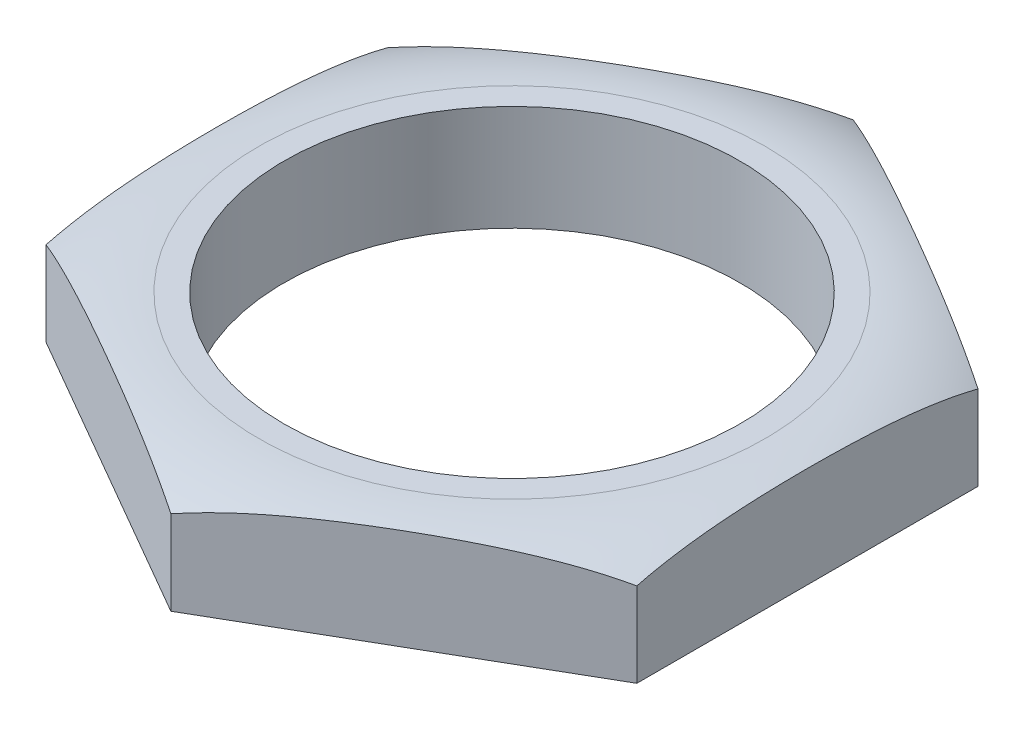
ISO-10303-21;
HEADER;
FILE_DESCRIPTION(('STEP AP214'),'2;1');
FILE_NAME('part.step','',(''),(''),'','','');
FILE_SCHEMA(('AUTOMOTIVE_DESIGN { 1 0 10303 214 1 1 1 1 }'));
ENDSEC;
DATA;
#1=APPLICATION_CONTEXT('core data for automotive mechanical design processes');
#2=APPLICATION_PROTOCOL_DEFINITION('international standard','automotive_design',2000,#1);
#3=PRODUCT_CONTEXT('',#1,'mechanical');
#4=PRODUCT('Part','Part','',(#3));
#5=PRODUCT_RELATED_PRODUCT_CATEGORY('part','',(#4));
#6=PRODUCT_DEFINITION_FORMATION('','',#4);
#7=PRODUCT_DEFINITION_CONTEXT('part definition',#1,'design');
#8=PRODUCT_DEFINITION('design','',#6,#7);
#9=PRODUCT_DEFINITION_SHAPE('','',#8);
#10=(LENGTH_UNIT() NAMED_UNIT(*) SI_UNIT(.MILLI.,.METRE.));
#11=(NAMED_UNIT(*) PLANE_ANGLE_UNIT() SI_UNIT($,.RADIAN.));
#12=(NAMED_UNIT(*) SI_UNIT($,.STERADIAN.) SOLID_ANGLE_UNIT());
#13=UNCERTAINTY_MEASURE_WITH_UNIT(LENGTH_MEASURE(1.E-05),#10,'distance_accuracy_value','');
#14=(GEOMETRIC_REPRESENTATION_CONTEXT(3) GLOBAL_UNCERTAINTY_ASSIGNED_CONTEXT((#13)) GLOBAL_UNIT_ASSIGNED_CONTEXT((#10,
#11,#12)) REPRESENTATION_CONTEXT('',''));
#15=CARTESIAN_POINT('',(0.,0.,0.));
#16=DIRECTION('',(0.,0.,1.));
#17=DIRECTION('',(1.,0.,0.));
#18=AXIS2_PLACEMENT_3D('',#15,#16,#17);
#19=CARTESIAN_POINT('',(-7.00000000000001,2.5,4.04145188432739));
#20=DIRECTION('',(0.5,0.,-0.866025403784439));
#21=DIRECTION('',(-0.866025403784439,0.,-0.5));
#22=AXIS2_PLACEMENT_3D('',#19,#20,#21);
#23=PLANE('',#22);
#24=CARTESIAN_POINT('',(-7.00020000000001,1.99994116980286,4.04133641427355));
#25=CARTESIAN_POINT('',(-6.9024311014993,2.0286993831664,4.09778331414131));
#26=CARTESIAN_POINT('',(-6.80418969926138,2.05522529599226,4.15450301416894));
#27=CARTESIAN_POINT('',(-6.60698058300385,2.10421745915421,4.26836175052687));
#28=CARTESIAN_POINT('',(-6.50801310707109,2.12668498334686,4.32550064939766));
#29=CARTESIAN_POINT('',(-6.21057702723731,2.18856517104633,4.49722545015641));
#30=CARTESIAN_POINT('',(-6.01125809296299,2.22254555707963,4.61230229051428));
#31=CARTESIAN_POINT('',(-5.61187383638535,2.27902121376591,4.84288689855947));
#32=CARTESIAN_POINT('',(-5.41181083347395,2.30153953390099,4.95839332714525));
#33=CARTESIAN_POINT('',(-5.01102203202369,2.33787021052581,5.18978884955075));
#34=CARTESIAN_POINT('',(-4.8102959726561,2.35167858888466,5.30567809396));
#35=CARTESIAN_POINT('',(-4.41139166909279,2.37247711056305,5.53598560100318));
#36=CARTESIAN_POINT('',(-4.21321681473248,2.37955940648222,5.65040190651472));
#37=CARTESIAN_POINT('',(-3.81680674878295,2.38844213687994,5.87926936480015));
#38=CARTESIAN_POINT('',(-3.61857154727333,2.39024320424813,5.9937205117546));
#39=CARTESIAN_POINT('',(-3.22195088730458,2.38889842275438,6.22270955655372));
#40=CARTESIAN_POINT('',(-3.02356543868272,2.38574852316797,6.33724744871886));
#41=CARTESIAN_POINT('',(-2.62692129753596,2.37391853623602,6.56625005038243));
#42=CARTESIAN_POINT('',(-2.42866259892704,2.3652387379873,6.68071476339347));
#43=CARTESIAN_POINT('',(-2.04346106415746,2.34159425160727,6.90311097318494));
#44=CARTESIAN_POINT('',(-1.85650172632777,2.32700568113752,7.01105199720843));
#45=CARTESIAN_POINT('',(-1.483336176554,2.28984184299611,7.22649922782261));
#46=CARTESIAN_POINT('',(-1.2971294295794,2.267273943215,7.33400574331332));
#47=CARTESIAN_POINT('',(-0.924632405346208,2.21176709168973,7.54906700052669));
#48=CARTESIAN_POINT('',(-0.738348978778219,2.17876375876016,7.65661778700128));
#49=CARTESIAN_POINT('',(-0.367459215426489,2.09976581999723,7.87075109171208));
#50=CARTESIAN_POINT('',(-0.182857484902704,2.05374271569793,7.97733095052286));
#51=CARTESIAN_POINT('',(0.000199999999992005,1.99994116980285,8.08301923870861));
#52=B_SPLINE_CURVE_WITH_KNOTS('',3,(#24,#25,#26,#27,#28,#29,#30,#31,#32,#33,#34,#35,#36,#37,#38,
#39,#40,#41,#42,#43,#44,#45,#46,#47,#48,#49,#50,#51),.UNSPECIFIED.,.F.,.F.,(4,2,2,2,2,2,2,2,2,2,
2,2,2,4),(0.,0.349439881640927,0.698769888950332,1.39630239063579,2.09242660183265,
2.78886852719074,3.47562481718198,4.16229880460008,4.84953489945155,5.53673506932823,
6.18574156363536,6.83415034176719,7.48664019182583,8.14056945107881),.UNSPECIFIED.);
#53=CARTESIAN_POINT('',(-7.00000000000001,2.00000000000001,4.04145188432739));
#54=VERTEX_POINT('',#53);
#55=CARTESIAN_POINT('',(0.,2.,8.08290376865477));
#56=VERTEX_POINT('',#55);
#57=EDGE_CURVE('E140',#54,#56,#52,.T.);
#58=ORIENTED_EDGE('',*,*,#57,.F.);
#59=DIRECTION('',(0.,-1.,0.));
#60=VECTOR('',#59,1.);
#61=CARTESIAN_POINT('',(-7.00000000000001,2.5,4.04145188432739));
#62=LINE('',#61,#60);
#63=CARTESIAN_POINT('',(-7.00000000000001,0.,4.04145188432739));
#64=VERTEX_POINT('',#63);
#65=EDGE_CURVE('E57',#54,#64,#62,.T.);
#66=ORIENTED_EDGE('',*,*,#65,.T.);
#67=DIRECTION('',(0.866025403784439,0.,0.5));
#68=VECTOR('',#67,1.);
#69=CARTESIAN_POINT('',(-7.00000000000001,0.,4.04145188432739));
#70=LINE('',#69,#68);
#71=CARTESIAN_POINT('',(0.,0.,8.08290376865477));
#72=VERTEX_POINT('',#71);
#73=EDGE_CURVE('E127',#64,#72,#70,.T.);
#74=ORIENTED_EDGE('',*,*,#73,.T.);
#75=DIRECTION('',(0.,-1.,0.));
#76=VECTOR('',#75,1.);
#77=CARTESIAN_POINT('',(0.,2.5,8.08290376865477));
#78=LINE('',#77,#76);
#79=EDGE_CURVE('E11',#56,#72,#78,.T.);
#80=ORIENTED_EDGE('',*,*,#79,.F.);
#81=EDGE_LOOP('',(#58,#66,#74,#80));
#82=FACE_BOUND('',#81,.T.);
#83=ADVANCED_FACE('F34',(#82),#23,.F.);
#84=CARTESIAN_POINT('',(0.,2.5,8.08290376865477));
#85=DIRECTION('',(-0.5,0.,-0.866025403784439));
#86=DIRECTION('',(-0.866025403784439,0.,0.5));
#87=AXIS2_PLACEMENT_3D('',#84,#85,#86);
#88=PLANE('',#87);
#89=CARTESIAN_POINT('',(-0.000199999999999705,1.99994116980285,8.08301923870861));
#90=CARTESIAN_POINT('',(0.0975688985007056,2.02869938316639,8.02657233884085));
#91=CARTESIAN_POINT('',(0.195810300738627,2.05522529599226,7.96985263881322));
#92=CARTESIAN_POINT('',(0.39301941699616,2.1042174591542,7.85599390245529));
#93=CARTESIAN_POINT('',(0.491986892928916,2.12668498334686,7.79885500358449));
#94=CARTESIAN_POINT('',(0.7894229727627,2.18856517104633,7.62713020282575));
#95=CARTESIAN_POINT('',(0.988741907037024,2.22254555707963,7.51205336246788));
#96=CARTESIAN_POINT('',(1.38812616361466,2.27902121376591,7.28146875442268));
#97=CARTESIAN_POINT('',(1.58818916652606,2.30153953390099,7.1659623258369));
#98=CARTESIAN_POINT('',(1.98897796797633,2.33787021052581,6.9345668034314));
#99=CARTESIAN_POINT('',(2.18970402734391,2.35167858888466,6.81867755902215));
#100=CARTESIAN_POINT('',(2.58860833090723,2.37247711056305,6.58837005197897));
#101=CARTESIAN_POINT('',(2.78678318526754,2.37955940648222,6.47395374646743));
#102=CARTESIAN_POINT('',(3.18319325121707,2.38844213687994,6.245086288182));
#103=CARTESIAN_POINT('',(3.38142845272669,2.39024320424813,6.13063514122755));
#104=CARTESIAN_POINT('',(3.77804911269544,2.38889842275438,5.90164609642843));
#105=CARTESIAN_POINT('',(3.9764345613173,2.38574852316797,5.78710820426329));
#106=CARTESIAN_POINT('',(4.37307870246407,2.37391853623602,5.55810560259972));
#107=CARTESIAN_POINT('',(4.57133740107298,2.3652387379873,5.44364088958868));
#108=CARTESIAN_POINT('',(4.95653893584256,2.34159425160727,5.2212446797972));
#109=CARTESIAN_POINT('',(5.14349827367225,2.32700568113752,5.11330365577372));
#110=CARTESIAN_POINT('',(5.51666382344602,2.28984184299611,4.89785642515954));
#111=CARTESIAN_POINT('',(5.70287057042062,2.267273943215,4.79034990966883));
#112=CARTESIAN_POINT('',(6.0753675946538,2.21176709168973,4.57528865245546));
#113=CARTESIAN_POINT('',(6.26165102122179,2.17876375876017,4.46773786598087));
#114=CARTESIAN_POINT('',(6.63254078457352,2.09976581999724,4.25360456127008));
#115=CARTESIAN_POINT('',(6.8171425150973,2.05374271569794,4.1470247024593));
#116=CARTESIAN_POINT('',(7.00019999999999,1.99994116980286,4.04133641427355));
#117=B_SPLINE_CURVE_WITH_KNOTS('',3,(#89,#90,#91,#92,#93,#94,#95,#96,#97,#98,#99,#100,#101,#102,
#103,#104,#105,#106,#107,#108,#109,#110,#111,#112,#113,#114,#115,#116),.UNSPECIFIED.,.F.,.F.,(4,
2,2,2,2,2,2,2,2,2,2,2,2,4),(0.,0.349439881640928,0.698769888950335,1.3963023906358,
2.09242660183266,2.78886852719076,3.475624817182,4.16229880460009,4.84953489945157,
5.53673506932825,6.18574156363537,6.8341503417672,7.48664019182583,8.1405694510788),.UNSPECIFIED.);
#118=CARTESIAN_POINT('',(7.,2.00000000000001,4.0414518843274));
#119=VERTEX_POINT('',#118);
#120=EDGE_CURVE('E141',#56,#119,#117,.T.);
#121=ORIENTED_EDGE('',*,*,#120,.F.);
#122=ORIENTED_EDGE('',*,*,#79,.T.);
#123=DIRECTION('',(0.866025403784439,0.,-0.5));
#124=VECTOR('',#123,1.);
#125=CARTESIAN_POINT('',(0.,0.,8.08290376865477));
#126=LINE('',#125,#124);
#127=CARTESIAN_POINT('',(7.,0.,4.04145188432739));
#128=VERTEX_POINT('',#127);
#129=EDGE_CURVE('E122',#72,#128,#126,.T.);
#130=ORIENTED_EDGE('',*,*,#129,.T.);
#131=DIRECTION('',(0.,-1.,0.));
#132=VECTOR('',#131,1.);
#133=CARTESIAN_POINT('',(7.,2.5,4.04145188432739));
#134=LINE('',#133,#132);
#135=EDGE_CURVE('E42',#119,#128,#134,.T.);
#136=ORIENTED_EDGE('',*,*,#135,.F.);
#137=EDGE_LOOP('',(#121,#122,#130,#136));
#138=FACE_BOUND('',#137,.T.);
#139=ADVANCED_FACE('F123',(#138),#88,.F.);
#140=CARTESIAN_POINT('',(7.,2.5,4.04145188432739));
#141=DIRECTION('',(-1.,0.,0.));
#142=DIRECTION('',(0.,0.,1.));
#143=AXIS2_PLACEMENT_3D('',#140,#141,#142);
#144=PLANE('',#143);
#145=CARTESIAN_POINT('',(6.99999999999999,2.38970607242398,0.));
#146=CARTESIAN_POINT('',(6.99999999999999,2.38970380710305,-0.153474797880013));
#147=CARTESIAN_POINT('',(6.99999999999999,2.38858612905045,-0.306948641245881));
#148=CARTESIAN_POINT('',(6.99999999999999,2.38401758755966,-0.613861027468486));
#149=CARTESIAN_POINT('',(6.99999999999999,2.38056674765726,-0.767299570665696));
#150=CARTESIAN_POINT('',(6.99999999999999,2.37106321640344,-1.0741518824378));
#151=CARTESIAN_POINT('',(6.99999999999999,2.36500964359593,-1.22756562498945));
#152=CARTESIAN_POINT('',(6.99999999999999,2.34985531271487,-1.53424094228322));
#153=CARTESIAN_POINT('',(6.99999999999999,2.34075451578797,-1.68750251506012));
#154=CARTESIAN_POINT('',(6.99999999999999,2.3080649192442,-2.14650821008781));
#155=CARTESIAN_POINT('',(6.99999999999999,2.27907832767328,-2.45191427477796));
#156=CARTESIAN_POINT('',(6.99999999999999,2.20067768750192,-3.05997729615631));
#157=CARTESIAN_POINT('',(6.99999999999999,2.15128001099699,-3.36263625794929));
#158=CARTESIAN_POINT('',(6.99999999999999,2.0186258035697,-3.99151659203636));
#159=CARTESIAN_POINT('',(6.99999999999999,1.9325495611885,-4.31717553159758));
#160=CARTESIAN_POINT('',(6.99999999999999,1.71722654974047,-4.95405760901862));
#161=CARTESIAN_POINT('',(6.99999999999999,1.58803539877385,-5.26529875972476));
#162=CARTESIAN_POINT('',(6.99999999999999,1.30834340724966,-5.80338189986762));
#163=CARTESIAN_POINT('',(6.99999999999999,1.16692743561404,-6.03483800474802));
#164=CARTESIAN_POINT('',(6.99999999999999,0.928233227054043,-6.36246423416456));
#165=CARTESIAN_POINT('',(6.99999999999999,0.844239207510924,-6.46841422047163));
#166=CARTESIAN_POINT('',(6.99999999999999,0.667320613679811,-6.67261053253427));
#167=CARTESIAN_POINT('',(6.99999999999999,0.574397823104398,-6.77085838986265));
#168=CARTESIAN_POINT('',(6.99999999999999,0.397912843244333,-6.94085531994078));
#169=CARTESIAN_POINT('',(6.99999999999999,0.315821463585398,-7.01413532931855));
#170=CARTESIAN_POINT('',(6.99999999999999,0.146079095604071,-7.153936074823));
#171=CARTESIAN_POINT('',(6.99999999999999,0.05842922210721,-7.220458159416));
#172=CARTESIAN_POINT('',(6.99999999999999,-0.122104708156981,-7.34601007506838));
#173=CARTESIAN_POINT('',(6.99999999999999,-0.214989263628966,-7.40503919052935));
#174=CARTESIAN_POINT('',(6.99999999999999,-0.405465187560716,-7.51484698382192));
#175=CARTESIAN_POINT('',(6.99999999999999,-0.503054275778988,-7.56562960752976));
#176=CARTESIAN_POINT('',(6.99999999999999,-0.702990876341273,-7.65859107812109));
#177=CARTESIAN_POINT('',(6.99999999999999,-0.805364025999912,-7.70071492477886));
#178=CARTESIAN_POINT('',(6.99999999999999,-1.01351545988163,-7.7753428365705));
#179=CARTESIAN_POINT('',(6.99999999999999,-1.11929221909229,-7.80785114526187));
#180=CARTESIAN_POINT('',(6.99999999999999,-1.33343125496827,-7.86278149447861));
#181=CARTESIAN_POINT('',(6.99999999999999,-1.44179337597888,-7.88520414061742));
#182=CARTESIAN_POINT('',(6.99999999999999,-1.66015904232018,-7.91961284032709));
#183=CARTESIAN_POINT('',(6.99999999999999,-1.77016242999534,-7.93159988983085));
#184=CARTESIAN_POINT('',(6.99999999999999,-1.97994119378055,-7.94429281633209));
#185=CARTESIAN_POINT('',(6.99999999999999,-2.0796576001692,-7.94599292316537));
#186=CARTESIAN_POINT('',(6.99999999999999,-2.2788971141417,-7.94073844585596));
#187=CARTESIAN_POINT('',(6.99999999999999,-2.37842014472676,-7.93378092721313));
#188=CARTESIAN_POINT('',(6.99999999999999,-2.57643634714082,-7.91129905778737));
#189=CARTESIAN_POINT('',(6.99999999999999,-2.67493010449194,-7.89577988197687));
#190=CARTESIAN_POINT('',(6.99999999999999,-2.87024413709382,-7.85638757995707));
#191=CARTESIAN_POINT('',(6.99999999999999,-2.96706377206045,-7.83251132855726));
#192=CARTESIAN_POINT('',(6.99999999999999,-3.24961476198406,-7.75002117367003));
#193=CARTESIAN_POINT('',(6.99999999999999,-3.43213651713589,-7.67998804117463));
#194=CARTESIAN_POINT('',(6.99999999999999,-3.78375625882706,-7.51220944744738));
#195=CARTESIAN_POINT('',(6.99999999999999,-3.95285319473115,-7.41446181999193));
#196=CARTESIAN_POINT('',(6.99999999999999,-4.28581822794355,-7.18760703783438));
#197=CARTESIAN_POINT('',(6.99999999999999,-4.44852815183203,-7.05680627610971));
#198=CARTESIAN_POINT('',(6.99999999999999,-4.75333265351634,-6.77301770900496));
#199=CARTESIAN_POINT('',(6.99999999999999,-4.89541094290621,-6.62001256203388));
#200=CARTESIAN_POINT('',(6.99999999999999,-5.12351287077039,-6.33957063845203));
#201=CARTESIAN_POINT('',(6.99999999999999,-5.2144322703192,-6.21604876030427));
#202=CARTESIAN_POINT('',(6.99999999999999,-5.38499478121861,-5.96142369386902));
#203=CARTESIAN_POINT('',(6.99999999999999,-5.46463352341515,-5.83031759564708));
#204=CARTESIAN_POINT('',(6.99999999999999,-5.68724788208596,-5.42796406276954));
#205=CARTESIAN_POINT('',(6.99999999999999,-5.81396431770249,-5.14762708255227));
#206=CARTESIAN_POINT('',(6.99999999999999,-6.01041854508655,-4.62420313737151));
#207=CARTESIAN_POINT('',(6.99999999999999,-6.08626885905089,-4.38329133387102));
#208=CARTESIAN_POINT('',(6.99999999999999,-6.21654925850452,-3.89560716687764));
#209=CARTESIAN_POINT('',(6.99999999999999,-6.27096223892484,-3.64883028937009));
#210=CARTESIAN_POINT('',(6.99999999999999,-6.36269037059578,-3.1508441112275));
#211=CARTESIAN_POINT('',(6.99999999999999,-6.39991016719901,-2.89961792933025));
#212=CARTESIAN_POINT('',(6.99999999999999,-6.46084811563187,-2.39566329281924));
#213=CARTESIAN_POINT('',(6.99999999999999,-6.48456981256615,-2.14293525028586));
#214=CARTESIAN_POINT('',(6.99999999999999,-6.51858850823015,-1.68215858925161));
#215=CARTESIAN_POINT('',(6.99999999999999,-6.5305299208123,-1.4742236086835));
#216=CARTESIAN_POINT('',(6.99999999999999,-6.54906143468367,-1.05810455238561));
#217=CARTESIAN_POINT('',(6.99999999999999,-6.55565109172148,-0.849920457412993));
#218=CARTESIAN_POINT('',(6.99999999999999,-6.56440651058935,-0.433298560899161));
#219=CARTESIAN_POINT('',(6.99999999999999,-6.56656873831265,-0.224860689466228));
#220=CARTESIAN_POINT('',(6.99999999999999,-6.56678723713752,0.192008531875751));
#221=CARTESIAN_POINT('',(6.99999999999999,-6.56484368342921,0.400439881683582));
#222=CARTESIAN_POINT('',(6.99999999999999,-6.55657163845878,0.816358710062174));
#223=CARTESIAN_POINT('',(6.99999999999999,-6.55026128189937,1.02384653308402));
#224=CARTESIAN_POINT('',(6.99999999999999,-6.53239018971206,1.43862365537169));
#225=CARTESIAN_POINT('',(6.99999999999999,-6.52082901392069,1.64591293653412));
#226=CARTESIAN_POINT('',(6.99999999999999,-6.49107253506154,2.05978432243926));
#227=CARTESIAN_POINT('',(6.99999999999999,-6.47288508693345,2.26636697336596));
#228=CARTESIAN_POINT('',(6.99999999999999,-6.42806910735174,2.67859610998877));
#229=CARTESIAN_POINT('',(7.,-6.40144271589586,2.88424281963031));
#230=CARTESIAN_POINT('',(7.,-6.3445190691219,3.24975962090773));
#231=CARTESIAN_POINT('',(7.,-6.31625001048584,3.40994262168731));
#232=CARTESIAN_POINT('',(7.,-6.25212076879051,3.72881934231341));
#233=CARTESIAN_POINT('',(7.,-6.21625984084868,3.88751291442666));
#234=CARTESIAN_POINT('',(7.,-6.13582370636988,4.20272110922243));
#235=CARTESIAN_POINT('',(7.,-6.0912474208148,4.35923545953024));
#236=CARTESIAN_POINT('',(7.,-5.99227926457707,4.66915357255124));
#237=CARTESIAN_POINT('',(7.,-5.93788770555855,4.82255743385972));
#238=CARTESIAN_POINT('',(7.,-5.81744361415367,5.12714453125906));
#239=CARTESIAN_POINT('',(7.,-5.75124405976618,5.27827013542966));
#240=CARTESIAN_POINT('',(7.,-5.60676552948873,5.57462580985689));
#241=CARTESIAN_POINT('',(7.,-5.52849004964834,5.71985757109346));
#242=CARTESIAN_POINT('',(7.,-5.35922285290208,6.00251022801988));
#243=CARTESIAN_POINT('',(7.,-5.26824715260247,6.13994065979281));
#244=CARTESIAN_POINT('',(7.,-5.07310020717452,6.40508109391197));
#245=CARTESIAN_POINT('',(7.,-4.96893559699309,6.53279593252323));
#246=CARTESIAN_POINT('',(7.,-4.78253027773868,6.73763399143548));
#247=CARTESIAN_POINT('',(7.,-4.70379806632288,6.81796702956086));
#248=CARTESIAN_POINT('',(7.,-4.540318291138,6.97224596864263));
#249=CARTESIAN_POINT('',(7.,-4.45557230662786,7.04619353524344));
#250=CARTESIAN_POINT('',(7.,-4.28031009926545,7.18691142957461));
#251=CARTESIAN_POINT('',(7.,-4.18979405130168,7.25368197467322));
#252=CARTESIAN_POINT('',(7.,-4.00342258484872,7.37922307594957));
#253=CARTESIAN_POINT('',(7.,-3.90756968410959,7.43799736017995));
#254=CARTESIAN_POINT('',(7.,-3.71032408786865,7.54720086865784));
#255=CARTESIAN_POINT('',(7.,-3.60889705056362,7.59756822861717));
#256=CARTESIAN_POINT('',(7.,-3.40186630654638,7.68871026796446));
#257=CARTESIAN_POINT('',(7.,-3.29626454183861,7.72948934770584));
#258=CARTESIAN_POINT('',(7.,-3.08167410328328,7.80086342201253));
#259=CARTESIAN_POINT('',(7.,-2.97268564482536,7.83145906278877));
#260=CARTESIAN_POINT('',(7.,-2.75226517810287,7.88197889287165));
#261=CARTESIAN_POINT('',(7.,-2.64083343686204,7.90190424233139));
#262=CARTESIAN_POINT('',(7.,-2.42828713428676,7.92925131876027));
#263=CARTESIAN_POINT('',(7.,-2.32731143330575,7.93776217651678));
#264=CARTESIAN_POINT('',(7.,-2.12496579268856,7.94585842612113));
#265=CARTESIAN_POINT('',(7.,-2.02359573018757,7.94544076870151));
#266=CARTESIAN_POINT('',(7.,-1.82135186970049,7.93567618224392));
#267=CARTESIAN_POINT('',(7.,-1.72047777862864,7.92633538770141));
#268=CARTESIAN_POINT('',(7.,-1.51992128828028,7.89887009464376));
#269=CARTESIAN_POINT('',(7.,-1.42023934448726,7.88074234225376));
#270=CARTESIAN_POINT('',(7.,-1.13225032443934,7.81533140302399));
#271=CARTESIAN_POINT('',(7.,-0.946431189926209,7.75655332582932));
#272=CARTESIAN_POINT('',(7.,-0.586702067967606,7.61017419221811));
#273=CARTESIAN_POINT('',(7.,-0.412793081505804,7.52257071676514));
#274=CARTESIAN_POINT('',(7.,-0.0713998261189954,7.31688328456176));
#275=CARTESIAN_POINT('',(7.,0.0952567509406784,7.19743107380679));
#276=CARTESIAN_POINT('',(7.,0.40920323530402,6.93534919153726));
#277=CARTESIAN_POINT('',(7.,0.556483471018514,6.79270802420508));
#278=CARTESIAN_POINT('',(7.,0.790990143441878,6.53294931832184));
#279=CARTESIAN_POINT('',(7.,0.883287798460253,6.42033107068375));
#280=CARTESIAN_POINT('',(7.,1.05759312254795,6.18737229192974));
#281=CARTESIAN_POINT('',(7.,1.13959726772831,6.06702913745626));
#282=CARTESIAN_POINT('',(7.,1.37063740287318,5.69633426627025));
#283=CARTESIAN_POINT('',(7.,1.50457660135089,5.43645926557818));
#284=CARTESIAN_POINT('',(7.,1.71047300790161,4.960730273259));
#285=CARTESIAN_POINT('',(7.,1.78958605638935,4.74782869719772));
#286=CARTESIAN_POINT('',(7.,1.9287042211905,4.31575039233941));
#287=CARTESIAN_POINT('',(7.,1.98869650340562,4.09656955592443));
#288=CARTESIAN_POINT('',(7.,2.09258189243331,3.65407418034792));
#289=CARTESIAN_POINT('',(7.,2.1364430608383,3.43075235037118));
#290=CARTESIAN_POINT('',(7.,2.21095405128979,2.98201160960899));
#291=CARTESIAN_POINT('',(6.99999999999999,2.24160617250766,2.75659307076118));
#292=CARTESIAN_POINT('',(6.99999999999999,2.29072189196327,2.32065837446527));
#293=CARTESIAN_POINT('',(6.99999999999999,2.30989573163815,2.11021911723506));
#294=CARTESIAN_POINT('',(6.99999999999999,2.34122733977781,1.6888374593472));
#295=CARTESIAN_POINT('',(6.99999999999999,2.35338515004378,1.47789506169477));
#296=CARTESIAN_POINT('',(6.99999999999999,2.37219095307572,1.05584328395048));
#297=CARTESIAN_POINT('',(6.99999999999999,2.37884068422983,0.844733977607092));
#298=CARTESIAN_POINT('',(6.99999999999999,2.38759989763807,0.422415847474331));
#299=CARTESIAN_POINT('',(6.99999999999999,2.38970918988489,0.211207019890145));
#300=CARTESIAN_POINT('',(6.99999999999999,2.38970607242398,0.));
#301=B_SPLINE_CURVE_WITH_KNOTS('',3,(#145,#146,#147,#148,#149,#150,#151,#152,#153,#154,#155,
#156,#157,#158,#159,#160,#161,#162,#163,#164,#165,#166,#167,#168,#169,#170,#171,#172,#173,#174,
#175,#176,#177,#178,#179,#180,#181,#182,#183,#184,#185,#186,#187,#188,#189,#190,#191,#192,#193,
#194,#195,#196,#197,#198,#199,#200,#201,#202,#203,#204,#205,#206,#207,#208,#209,#210,#211,#212,
#213,#214,#215,#216,#217,#218,#219,#220,#221,#222,#223,#224,#225,#226,#227,#228,#229,#230,#231,
#232,#233,#234,#235,#236,#237,#238,#239,#240,#241,#242,#243,#244,#245,#246,#247,#248,#249,#250,
#251,#252,#253,#254,#255,#256,#257,#258,#259,#260,#261,#262,#263,#264,#265,#266,#267,#268,#269,
#270,#271,#272,#273,#274,#275,#276,#277,#278,#279,#280,#281,#282,#283,#284,#285,#286,#287,#288,
#289,#290,#291,#292,#293,#294,#295,#296,#297,#298,#299,#300),.UNSPECIFIED.,.T.,.F.,(4,2,2,2,2,2,
2,2,2,2,2,2,2,2,2,2,2,2,2,2,2,2,2,2,2,2,2,2,2,2,2,2,2,2,2,2,2,2,2,2,2,2,2,2,2,2,2,2,2,2,2,2,2,2,
2,2,2,2,2,2,2,2,2,2,2,2,2,2,2,2,2,2,2,2,2,2,2,4),(0.,0.460418193545401,0.920831742687712,
1.38140134102967,1.8419768120439,2.76180550663538,3.68089781808519,4.68914910012407,
5.6961047364611,6.50646555562077,6.9116535306853,7.3167607284291,7.64656421856631,
7.97630177040681,8.30607078940291,8.63568154879129,8.96732535251315,9.29882257508887,
9.63029988960375,9.96174556573918,10.2605685250411,10.5594927979104,10.8582365878805,
11.1570922148803,11.7407885194304,12.3245304595027,12.9483932507842,13.5727459266056,
14.0322570418937,14.4919456483542,15.4111182554443,16.1678090237024,16.9251023463938,
17.6865466850622,18.44779094762,19.0725468688563,19.6973546460388,20.322660969395,
20.9479406120147,21.5706390204822,22.1933896378873,22.8154044212551,23.4372615964284,
23.9250843604531,24.4129550098146,24.9008860990354,25.3888016977177,25.8832807888448,
26.3776169931552,26.8713353153236,27.3648062421044,27.7019478642097,28.0390012758854,
28.3760444764492,28.7129299967525,29.0521946133448,29.3913032258536,29.7303903154274,
30.0694405294527,30.3730562541394,30.6767756713573,30.9802864371198,31.2839096811045,
31.8657481442528,32.4476354479255,33.0603316701021,33.6733325650593,34.1095851718075,
34.5459867206775,35.4193494311912,36.0998407941974,36.7807879543085,37.4630761721432,
38.145245582636,38.779035476024,39.4128215932812,40.0464076069281,40.6800201342301),.UNSPECIFIED.);
#302=CARTESIAN_POINT('',(7.00000000000001,2.00000000000002,-4.04145188432737));
#303=VERTEX_POINT('',#302);
#304=EDGE_CURVE('E89',#119,#303,#301,.T.);
#305=ORIENTED_EDGE('',*,*,#304,.F.);
#306=ORIENTED_EDGE('',*,*,#135,.T.);
#307=DIRECTION('',(0.,0.,-1.));
#308=VECTOR('',#307,1.);
#309=CARTESIAN_POINT('',(7.,0.,4.04145188432739));
#310=LINE('',#309,#308);
#311=CARTESIAN_POINT('',(6.99999999999999,0.,-4.04145188432738));
#312=VERTEX_POINT('',#311);
#313=EDGE_CURVE('E118',#128,#312,#310,.T.);
#314=ORIENTED_EDGE('',*,*,#313,.T.);
#315=DIRECTION('',(0.,-1.,0.));
#316=VECTOR('',#315,1.);
#317=CARTESIAN_POINT('',(6.99999999999999,2.5,-4.04145188432738));
#318=LINE('',#317,#316);
#319=EDGE_CURVE('E107',#303,#312,#318,.T.);
#320=ORIENTED_EDGE('',*,*,#319,.F.);
#321=EDGE_LOOP('',(#305,#306,#314,#320));
#322=FACE_BOUND('',#321,.T.);
#323=ADVANCED_FACE('F116',(#322),#144,.F.);
#324=CARTESIAN_POINT('',(6.99999999999999,2.5,-4.04145188432738));
#325=DIRECTION('',(-0.5,0.,0.866025403784439));
#326=DIRECTION('',(0.866025403784439,0.,0.5));
#327=AXIS2_PLACEMENT_3D('',#324,#325,#326);
#328=PLANE('',#327);
#329=CARTESIAN_POINT('',(7.00019999999999,1.99994116980288,-4.04133641427354));
#330=CARTESIAN_POINT('',(6.90243110149929,2.02869938316642,-4.0977833141413));
#331=CARTESIAN_POINT('',(6.80418969926136,2.05522529599228,-4.15450301416893));
#332=CARTESIAN_POINT('',(6.60698058300383,2.10421745915423,-4.26836175052686));
#333=CARTESIAN_POINT('',(6.50801310707107,2.12668498334688,-4.32550064939766));
#334=CARTESIAN_POINT('',(6.21057702723729,2.18856517104635,-4.4972254501564));
#335=CARTESIAN_POINT('',(6.01125809296296,2.22254555707965,-4.61230229051427));
#336=CARTESIAN_POINT('',(5.61187383638532,2.27902121376593,-4.84288689855947));
#337=CARTESIAN_POINT('',(5.41181083347391,2.30153953390101,-4.95839332714526));
#338=CARTESIAN_POINT('',(5.01102203202365,2.33787021052584,-5.18978884955076));
#339=CARTESIAN_POINT('',(4.81029597265606,2.35167858888469,-5.30567809396001));
#340=CARTESIAN_POINT('',(4.41139166909274,2.37247711056308,-5.53598560100319));
#341=CARTESIAN_POINT('',(4.21321681473243,2.37955940648224,-5.65040190651473));
#342=CARTESIAN_POINT('',(3.8168067487829,2.38844213687996,-5.87926936480017));
#343=CARTESIAN_POINT('',(3.61857154727327,2.39024320424815,-5.99372051175461));
#344=CARTESIAN_POINT('',(3.22195088730451,2.3888984227544,-6.22270955655374));
#345=CARTESIAN_POINT('',(3.02356543868265,2.38574852316799,-6.33724744871888));
#346=CARTESIAN_POINT('',(2.62692129753588,2.37391853623604,-6.56625005038245));
#347=CARTESIAN_POINT('',(2.42866259892697,2.36523873798732,-6.6807147633935));
#348=CARTESIAN_POINT('',(2.04346106415739,2.34159425160729,-6.90311097318497));
#349=CARTESIAN_POINT('',(1.85650172632771,2.32700568113754,-7.01105199720845));
#350=CARTESIAN_POINT('',(1.48333617655395,2.28984184299613,-7.22649922782262));
#351=CARTESIAN_POINT('',(1.29712942957935,2.26727394321502,-7.33400574331333));
#352=CARTESIAN_POINT('',(0.924632405346171,2.21176709168975,-7.54906700052669));
#353=CARTESIAN_POINT('',(0.738348978778189,2.17876375876019,-7.65661778700128));
#354=CARTESIAN_POINT('',(0.36745921542647,2.09976581999726,-7.87075109171207));
#355=CARTESIAN_POINT('',(0.18285748490269,2.05374271569796,-7.97733095052285));
#356=CARTESIAN_POINT('',(-0.000200000000000166,1.99994116980288,-8.08301923870859));
#357=B_SPLINE_CURVE_WITH_KNOTS('',3,(#329,#330,#331,#332,#333,#334,#335,#336,#337,#338,#339,
#340,#341,#342,#343,#344,#345,#346,#347,#348,#349,#350,#351,#352,#353,#354,#355,#356),
.UNSPECIFIED.,.F.,.F.,(4,2,2,2,2,2,2,2,2,2,2,2,2,4),(0.,0.34943988164093,0.69876988895034,
1.39630239063581,2.09242660183268,2.78886852719078,3.47562481718203,4.16229880460013,
4.84953489945162,5.5367350693283,6.18574156363541,6.83415034176722,7.48664019182584,
8.1405694510788),.UNSPECIFIED.);
#358=CARTESIAN_POINT('',(0.,2.00000000000003,-8.08290376865476));
#359=VERTEX_POINT('',#358);
#360=EDGE_CURVE('E86',#303,#359,#357,.T.);
#361=ORIENTED_EDGE('',*,*,#360,.F.);
#362=ORIENTED_EDGE('',*,*,#319,.T.);
#363=DIRECTION('',(-0.866025403784439,0.,-0.5));
#364=VECTOR('',#363,1.);
#365=CARTESIAN_POINT('',(6.99999999999999,0.,-4.04145188432738));
#366=LINE('',#365,#364);
#367=CARTESIAN_POINT('',(0.,0.,-8.08290376865476));
#368=VERTEX_POINT('',#367);
#369=EDGE_CURVE('E105',#312,#368,#366,.T.);
#370=ORIENTED_EDGE('',*,*,#369,.T.);
#371=DIRECTION('',(0.,-1.,0.));
#372=VECTOR('',#371,1.);
#373=CARTESIAN_POINT('',(0.,2.5,-8.08290376865476));
#374=LINE('',#373,#372);
#375=EDGE_CURVE('E98',#359,#368,#374,.T.);
#376=ORIENTED_EDGE('',*,*,#375,.F.);
#377=EDGE_LOOP('',(#361,#362,#370,#376));
#378=FACE_BOUND('',#377,.T.);
#379=ADVANCED_FACE('F103',(#378),#328,.F.);
#380=CARTESIAN_POINT('',(0.,2.5,-8.08290376865476));
#381=DIRECTION('',(0.5,0.,0.866025403784438));
#382=DIRECTION('',(0.866025403784438,0.,-0.5));
#383=AXIS2_PLACEMENT_3D('',#380,#381,#382);
#384=PLANE('',#383);
#385=CARTESIAN_POINT('',(0.000199999999992063,1.99994116980288,-8.08301923870859));
#386=CARTESIAN_POINT('',(-0.0975688985007135,2.02869938316642,-8.02657233884084));
#387=CARTESIAN_POINT('',(-0.195810300738636,2.05522529599229,-7.96985263881321));
#388=CARTESIAN_POINT('',(-0.39301941699617,2.10421745915423,-7.85599390245527));
#389=CARTESIAN_POINT('',(-0.491986892928926,2.12668498334689,-7.79885500358448));
#390=CARTESIAN_POINT('',(-0.789422972762712,2.18856517104636,-7.62713020282573));
#391=CARTESIAN_POINT('',(-0.988741907037038,2.22254555707966,-7.51205336246786));
#392=CARTESIAN_POINT('',(-1.38812616361468,2.27902121376594,-7.28146875442266));
#393=CARTESIAN_POINT('',(-1.58818916652608,2.30153953390101,-7.16596232583688));
#394=CARTESIAN_POINT('',(-1.98897796797635,2.33787021052584,-6.93456680343138));
#395=CARTESIAN_POINT('',(-2.18970402734393,2.35167858888469,-6.81867755902213));
#396=CARTESIAN_POINT('',(-2.58860833090725,2.37247711056308,-6.58837005197895));
#397=CARTESIAN_POINT('',(-2.78678318526757,2.37955940648224,-6.47395374646741));
#398=CARTESIAN_POINT('',(-3.1831932512171,2.38844213687996,-6.24508628818197));
#399=CARTESIAN_POINT('',(-3.38142845272672,2.39024320424815,-6.13063514122752));
#400=CARTESIAN_POINT('',(-3.77804911269548,2.3888984227544,-5.9016460964284));
#401=CARTESIAN_POINT('',(-3.97643456131734,2.38574852316799,-5.78710820426326));
#402=CARTESIAN_POINT('',(-4.37307870246411,2.37391853623604,-5.55810560259969));
#403=CARTESIAN_POINT('',(-4.57133740107302,2.36523873798732,-5.44364088958864));
#404=CARTESIAN_POINT('',(-4.9565389358426,2.34159425160729,-5.22124467979717));
#405=CARTESIAN_POINT('',(-5.14349827367228,2.32700568113753,-5.11330365577369));
#406=CARTESIAN_POINT('',(-5.51666382344605,2.28984184299613,-4.89785642515951));
#407=CARTESIAN_POINT('',(-5.70287057042064,2.26727394321502,-4.7903499096688));
#408=CARTESIAN_POINT('',(-6.07536759465383,2.21176709168974,-4.57528865245544));
#409=CARTESIAN_POINT('',(-6.26165102122181,2.17876375876018,-4.46773786598085));
#410=CARTESIAN_POINT('',(-6.63254078457353,2.09976581999725,-4.25360456127005));
#411=CARTESIAN_POINT('',(-6.81714251509731,2.05374271569796,-4.14702470245928));
#412=CARTESIAN_POINT('',(-7.0002,1.99994116980287,-4.04133641427353));
#413=B_SPLINE_CURVE_WITH_KNOTS('',3,(#385,#386,#387,#388,#389,#390,#391,#392,#393,#394,#395,
#396,#397,#398,#399,#400,#401,#402,#403,#404,#405,#406,#407,#408,#409,#410,#411,#412),
.UNSPECIFIED.,.F.,.F.,(4,2,2,2,2,2,2,2,2,2,2,2,2,4),(0.,0.34943988164093,0.69876988895034,
1.39630239063581,2.09242660183268,2.78886852719077,3.47562481718202,4.16229880460012,
4.8495348994516,5.53673506932829,6.1857415636354,6.83415034176722,7.48664019182584,
8.1405694510788),.UNSPECIFIED.);
#414=CARTESIAN_POINT('',(-7.00000000000001,2.00000000000002,-4.04145188432737));
#415=VERTEX_POINT('',#414);
#416=EDGE_CURVE('E49',#359,#415,#413,.T.);
#417=ORIENTED_EDGE('',*,*,#416,.F.);
#418=ORIENTED_EDGE('',*,*,#375,.T.);
#419=DIRECTION('',(-0.866025403784438,0.,0.5));
#420=VECTOR('',#419,1.);
#421=CARTESIAN_POINT('',(0.,0.,-8.08290376865476));
#422=LINE('',#421,#420);
#423=CARTESIAN_POINT('',(-7.00000000000001,0.,-4.04145188432737));
#424=VERTEX_POINT('',#423);
#425=EDGE_CURVE('E131',#368,#424,#422,.T.);
#426=ORIENTED_EDGE('',*,*,#425,.T.);
#427=DIRECTION('',(0.,-1.,0.));
#428=VECTOR('',#427,1.);
#429=CARTESIAN_POINT('',(-7.00000000000001,2.5,-4.04145188432737));
#430=LINE('',#429,#428);
#431=EDGE_CURVE('E100',#415,#424,#430,.T.);
#432=ORIENTED_EDGE('',*,*,#431,.F.);
#433=EDGE_LOOP('',(#417,#418,#426,#432));
#434=FACE_BOUND('',#433,.T.);
#435=ADVANCED_FACE('F96',(#434),#384,.F.);
#436=CARTESIAN_POINT('',(-7.00000000000001,2.5,-4.04145188432737));
#437=DIRECTION('',(1.,0.,0.));
#438=DIRECTION('',(0.,0.,-1.));
#439=AXIS2_PLACEMENT_3D('',#436,#437,#438);
#440=PLANE('',#439);
#441=CARTESIAN_POINT('',(-7.00000000000001,2.38970607242397,0.));
#442=CARTESIAN_POINT('',(-7.00000000000001,2.38970380710304,0.153474797880027));
#443=CARTESIAN_POINT('',(-7.00000000000001,2.38858612905044,0.306948641245896));
#444=CARTESIAN_POINT('',(-7.00000000000001,2.38401758755965,0.613861027468504));
#445=CARTESIAN_POINT('',(-7.00000000000001,2.38056674765726,0.767299570665714));
#446=CARTESIAN_POINT('',(-7.00000000000001,2.37106321640343,1.07415188243781));
#447=CARTESIAN_POINT('',(-7.00000000000001,2.36500964359593,1.22756562498947));
#448=CARTESIAN_POINT('',(-7.00000000000001,2.34985531271486,1.53424094228324));
#449=CARTESIAN_POINT('',(-7.00000000000001,2.34075451578796,1.68750251506014));
#450=CARTESIAN_POINT('',(-7.00000000000001,2.30806491924419,2.14650821008783));
#451=CARTESIAN_POINT('',(-7.00000000000001,2.27907832767327,2.45191427477798));
#452=CARTESIAN_POINT('',(-7.00000000000001,2.2006776875019,3.05997729615634));
#453=CARTESIAN_POINT('',(-7.00000000000001,2.15128001099697,3.36263625794932));
#454=CARTESIAN_POINT('',(-7.00000000000001,2.01862580356968,3.99151659203639));
#455=CARTESIAN_POINT('',(-7.00000000000001,1.93254956118847,4.31717553159761));
#456=CARTESIAN_POINT('',(-7.00000000000001,1.71722654974045,4.95405760901863));
#457=CARTESIAN_POINT('',(-7.00000000000001,1.58803539877382,5.26529875972477));
#458=CARTESIAN_POINT('',(-7.00000000000001,1.30834340724963,5.80338189986762));
#459=CARTESIAN_POINT('',(-7.00000000000001,1.16692743561401,6.03483800474803));
#460=CARTESIAN_POINT('',(-7.00000000000001,0.928233227054007,6.36246423416457));
#461=CARTESIAN_POINT('',(-7.00000000000001,0.844239207510889,6.46841422047163));
#462=CARTESIAN_POINT('',(-7.00000000000001,0.667320613679775,6.67261053253427));
#463=CARTESIAN_POINT('',(-7.00000000000001,0.574397823104361,6.77085838986265));
#464=CARTESIAN_POINT('',(-7.00000000000001,0.397912843244295,6.94085531994078));
#465=CARTESIAN_POINT('',(-7.00000000000001,0.315821463585361,7.01413532931855));
#466=CARTESIAN_POINT('',(-7.00000000000001,0.146079095604032,7.15393607482299));
#467=CARTESIAN_POINT('',(-7.00000000000001,0.0584292221071701,7.22045815941599));
#468=CARTESIAN_POINT('',(-7.00000000000001,-0.122104708157021,7.34601007506838));
#469=CARTESIAN_POINT('',(-7.00000000000001,-0.214989263629006,7.40503919052934));
#470=CARTESIAN_POINT('',(-7.00000000000001,-0.405465187560755,7.51484698382191));
#471=CARTESIAN_POINT('',(-7.00000000000001,-0.503054275779026,7.56562960752975));
#472=CARTESIAN_POINT('',(-7.00000000000001,-0.702990876341312,7.65859107812108));
#473=CARTESIAN_POINT('',(-7.00000000000001,-0.80536402599995,7.70071492477884));
#474=CARTESIAN_POINT('',(-7.00000000000001,-1.01351545988167,7.77534283657049));
#475=CARTESIAN_POINT('',(-7.00000000000001,-1.11929221909233,7.80785114526186));
#476=CARTESIAN_POINT('',(-7.00000000000001,-1.3334312549683,7.86278149447859));
#477=CARTESIAN_POINT('',(-7.00000000000001,-1.44179337597892,7.8852041406174));
#478=CARTESIAN_POINT('',(-7.00000000000001,-1.66015904232022,7.91961284032707));
#479=CARTESIAN_POINT('',(-7.00000000000001,-1.77016242999537,7.93159988983083));
#480=CARTESIAN_POINT('',(-7.00000000000001,-1.97994119378058,7.94429281633207));
#481=CARTESIAN_POINT('',(-7.00000000000001,-2.07965760016923,7.94599292316535));
#482=CARTESIAN_POINT('',(-7.00000000000001,-2.27889711414174,7.94073844585594));
#483=CARTESIAN_POINT('',(-7.00000000000001,-2.37842014472679,7.93378092721311));
#484=CARTESIAN_POINT('',(-7.00000000000001,-2.57643634714086,7.91129905778735));
#485=CARTESIAN_POINT('',(-7.00000000000001,-2.67493010449197,7.89577988197684));
#486=CARTESIAN_POINT('',(-7.00000000000001,-2.87024413709386,7.85638757995704));
#487=CARTESIAN_POINT('',(-7.00000000000001,-2.96706377206048,7.83251132855724));
#488=CARTESIAN_POINT('',(-7.00000000000001,-3.2496147619841,7.75002117367));
#489=CARTESIAN_POINT('',(-7.00000000000001,-3.43213651713592,7.6799880411746));
#490=CARTESIAN_POINT('',(-7.00000000000001,-3.78375625882709,7.51220944744735));
#491=CARTESIAN_POINT('',(-7.00000000000001,-3.95285319473118,7.4144618199919));
#492=CARTESIAN_POINT('',(-7.00000000000001,-4.28581822794358,7.18760703783435));
#493=CARTESIAN_POINT('',(-7.00000000000001,-4.44852815183206,7.05680627610968));
#494=CARTESIAN_POINT('',(-7.00000000000001,-4.75333265351637,6.77301770900493));
#495=CARTESIAN_POINT('',(-7.00000000000001,-4.89541094290623,6.62001256203384));
#496=CARTESIAN_POINT('',(-7.00000000000001,-5.12351287077041,6.33957063845199));
#497=CARTESIAN_POINT('',(-7.00000000000001,-5.21443227031922,6.21604876030423));
#498=CARTESIAN_POINT('',(-7.00000000000001,-5.38499478121863,5.96142369386898));
#499=CARTESIAN_POINT('',(-7.00000000000001,-5.46463352341517,5.83031759564704));
#500=CARTESIAN_POINT('',(-7.00000000000001,-5.68724788208598,5.42796406276949));
#501=CARTESIAN_POINT('',(-7.00000000000001,-5.81396431770251,5.14762708255223));
#502=CARTESIAN_POINT('',(-7.00000000000001,-6.01041854508656,4.62420313737146));
#503=CARTESIAN_POINT('',(-7.00000000000001,-6.0862688590509,4.38329133387097));
#504=CARTESIAN_POINT('',(-7.00000000000001,-6.21654925850453,3.89560716687758));
#505=CARTESIAN_POINT('',(-7.00000000000001,-6.27096223892486,3.64883028937003));
#506=CARTESIAN_POINT('',(-7.00000000000001,-6.36269037059579,3.15084411122744));
#507=CARTESIAN_POINT('',(-7.00000000000001,-6.39991016719902,2.89961792933019));
#508=CARTESIAN_POINT('',(-7.00000000000001,-6.46084811563188,2.39566329281918));
#509=CARTESIAN_POINT('',(-7.00000000000001,-6.48456981256616,2.1429352502858));
#510=CARTESIAN_POINT('',(-7.00000000000001,-6.51858850823016,1.68215858925155));
#511=CARTESIAN_POINT('',(-7.00000000000001,-6.5305299208123,1.47422360868344));
#512=CARTESIAN_POINT('',(-7.00000000000001,-6.54906143468367,1.05810455238556));
#513=CARTESIAN_POINT('',(-7.00000000000001,-6.55565109172148,0.849920457412947));
#514=CARTESIAN_POINT('',(-7.00000000000001,-6.56440651058935,0.433298560899124));
#515=CARTESIAN_POINT('',(-7.00000000000001,-6.56656873831265,0.224860689466196));
#516=CARTESIAN_POINT('',(-7.00000000000001,-6.56678723713752,-0.192008531875773));
#517=CARTESIAN_POINT('',(-7.00000000000001,-6.5648436834292,-0.400439881683599));
#518=CARTESIAN_POINT('',(-7.00000000000001,-6.55657163845878,-0.81635871006218));
#519=CARTESIAN_POINT('',(-7.00000000000001,-6.55026128189936,-1.02384653308402));
#520=CARTESIAN_POINT('',(-7.00000000000001,-6.53239018971205,-1.43862365537168));
#521=CARTESIAN_POINT('',(-7.00000000000001,-6.52082901392069,-1.6459129365341));
#522=CARTESIAN_POINT('',(-7.00000000000001,-6.49107253506153,-2.05978432243923));
#523=CARTESIAN_POINT('',(-7.00000000000001,-6.47288508693344,-2.26636697336593));
#524=CARTESIAN_POINT('',(-7.00000000000001,-6.42806910735174,-2.67859610998873));
#525=CARTESIAN_POINT('',(-7.00000000000001,-6.40144271589585,-2.88424281963027));
#526=CARTESIAN_POINT('',(-7.00000000000001,-6.3445190691219,-3.24975962090769));
#527=CARTESIAN_POINT('',(-7.00000000000001,-6.31625001048583,-3.40994262168727));
#528=CARTESIAN_POINT('',(-7.00000000000001,-6.2521207687905,-3.72881934231338));
#529=CARTESIAN_POINT('',(-7.00000000000001,-6.21625984084868,-3.88751291442664));
#530=CARTESIAN_POINT('',(-7.00000000000001,-6.13582370636987,-4.20272110922242));
#531=CARTESIAN_POINT('',(-7.00000000000001,-6.09124742081479,-4.35923545953023));
#532=CARTESIAN_POINT('',(-7.00000000000001,-5.99227926457706,-4.66915357255123));
#533=CARTESIAN_POINT('',(-7.00000000000001,-5.93788770555854,-4.82255743385972));
#534=CARTESIAN_POINT('',(-7.00000000000001,-5.81744361415365,-5.12714453125906));
#535=CARTESIAN_POINT('',(-7.00000000000001,-5.75124405976616,-5.27827013542967));
#536=CARTESIAN_POINT('',(-7.00000000000001,-5.60676552948871,-5.57462580985691));
#537=CARTESIAN_POINT('',(-7.00000000000001,-5.52849004964831,-5.71985757109348));
#538=CARTESIAN_POINT('',(-7.00000000000001,-5.35922285290205,-6.00251022801991));
#539=CARTESIAN_POINT('',(-7.00000000000001,-5.26824715260243,-6.13994065979284));
#540=CARTESIAN_POINT('',(-7.00000000000001,-5.07310020717447,-6.40508109391201));
#541=CARTESIAN_POINT('',(-7.00000000000001,-4.96893559699303,-6.53279593252327));
#542=CARTESIAN_POINT('',(-7.00000000000001,-4.78253027773862,-6.73763399143552));
#543=CARTESIAN_POINT('',(-7.00000000000001,-4.70379806632282,-6.8179670295609));
#544=CARTESIAN_POINT('',(-7.00000000000001,-4.54031829113793,-6.97224596864267));
#545=CARTESIAN_POINT('',(-7.00000000000001,-4.4555723066278,-7.04619353524348));
#546=CARTESIAN_POINT('',(-7.00000000000001,-4.28031009926539,-7.18691142957464));
#547=CARTESIAN_POINT('',(-7.00000000000001,-4.18979405130161,-7.25368197467326));
#548=CARTESIAN_POINT('',(-7.00000000000001,-4.00342258484866,-7.3792230759496));
#549=CARTESIAN_POINT('',(-7.00000000000001,-3.90756968410953,-7.43799736017998));
#550=CARTESIAN_POINT('',(-7.00000000000001,-3.71032408786859,-7.54720086865786));
#551=CARTESIAN_POINT('',(-7.00000000000001,-3.60889705056356,-7.59756822861719));
#552=CARTESIAN_POINT('',(-7.00000000000001,-3.40186630654632,-7.68871026796447));
#553=CARTESIAN_POINT('',(-7.00000000000001,-3.29626454183854,-7.72948934770586));
#554=CARTESIAN_POINT('',(-7.00000000000001,-3.08167410328321,-7.80086342201254));
#555=CARTESIAN_POINT('',(-7.00000000000001,-2.97268564482529,-7.83145906278878));
#556=CARTESIAN_POINT('',(-7.00000000000001,-2.7522651781028,-7.88197889287166));
#557=CARTESIAN_POINT('',(-7.00000000000001,-2.64083343686198,-7.9019042423314));
#558=CARTESIAN_POINT('',(-7.00000000000001,-2.4282871342867,-7.92925131876027));
#559=CARTESIAN_POINT('',(-7.00000000000001,-2.32731143330569,-7.93776217651678));
#560=CARTESIAN_POINT('',(-7.00000000000001,-2.1249657926885,-7.94585842612113));
#561=CARTESIAN_POINT('',(-7.00000000000001,-2.02359573018751,-7.94544076870151));
#562=CARTESIAN_POINT('',(-7.00000000000001,-1.82135186970042,-7.93567618224392));
#563=CARTESIAN_POINT('',(-7.00000000000001,-1.72047777862858,-7.92633538770141));
#564=CARTESIAN_POINT('',(-7.00000000000001,-1.51992128828022,-7.89887009464376));
#565=CARTESIAN_POINT('',(-7.00000000000001,-1.4202393444872,-7.88074234225375));
#566=CARTESIAN_POINT('',(-7.00000000000001,-1.13225032443928,-7.81533140302398));
#567=CARTESIAN_POINT('',(-7.00000000000001,-0.946431189926154,-7.75655332582931));
#568=CARTESIAN_POINT('',(-7.00000000000001,-0.586702067967554,-7.61017419221809));
#569=CARTESIAN_POINT('',(-7.00000000000001,-0.412793081505752,-7.52257071676512));
#570=CARTESIAN_POINT('',(-7.00000000000001,-0.0713998261189454,-7.31688328456173));
#571=CARTESIAN_POINT('',(-7.00000000000001,0.0952567509407261,-7.19743107380677));
#572=CARTESIAN_POINT('',(-7.00000000000001,0.409203235304066,-6.93534919153722));
#573=CARTESIAN_POINT('',(-7.00000000000001,0.556483471018559,-6.79270802420505));
#574=CARTESIAN_POINT('',(-7.00000000000001,0.790990143441922,-6.5329493183218));
#575=CARTESIAN_POINT('',(-7.00000000000001,0.883287798460296,-6.42033107068371));
#576=CARTESIAN_POINT('',(-7.00000000000001,1.05759312254799,-6.18737229192969));
#577=CARTESIAN_POINT('',(-7.00000000000001,1.13959726772835,-6.06702913745622));
#578=CARTESIAN_POINT('',(-7.00000000000001,1.37063740287322,-5.6963342662702));
#579=CARTESIAN_POINT('',(-7.00000000000001,1.50457660135092,-5.43645926557813));
#580=CARTESIAN_POINT('',(-7.00000000000001,1.71047300790164,-4.96073027325894));
#581=CARTESIAN_POINT('',(-7.00000000000001,1.78958605638938,-4.74782869719765));
#582=CARTESIAN_POINT('',(-7.00000000000001,1.92870422119052,-4.31575039233933));
#583=CARTESIAN_POINT('',(-7.00000000000001,1.98869650340565,-4.09656955592435));
#584=CARTESIAN_POINT('',(-7.00000000000001,2.09258189243333,-3.65407418034783));
#585=CARTESIAN_POINT('',(-7.00000000000001,2.13644306083832,-3.4307523503711));
#586=CARTESIAN_POINT('',(-7.00000000000001,2.21095405128981,-2.9820116096089));
#587=CARTESIAN_POINT('',(-7.00000000000001,2.24160617250767,-2.75659307076109));
#588=CARTESIAN_POINT('',(-7.00000000000001,2.29072189196329,-2.32065837446518));
#589=CARTESIAN_POINT('',(-7.00000000000001,2.30989573163816,-2.11021911723497));
#590=CARTESIAN_POINT('',(-7.00000000000001,2.34122733977782,-1.68883745934713));
#591=CARTESIAN_POINT('',(-7.00000000000001,2.35338515004379,-1.4778950616947));
#592=CARTESIAN_POINT('',(-7.00000000000001,2.37219095307573,-1.05584328395043));
#593=CARTESIAN_POINT('',(-7.00000000000001,2.37884068422983,-0.844733977607045));
#594=CARTESIAN_POINT('',(-7.00000000000001,2.38759989763807,-0.422415847474299));
#595=CARTESIAN_POINT('',(-7.00000000000001,2.38970918988488,-0.211207019890122));
#596=CARTESIAN_POINT('',(-7.00000000000001,2.38970607242397,0.));
#597=B_SPLINE_CURVE_WITH_KNOTS('',3,(#441,#442,#443,#444,#445,#446,#447,#448,#449,#450,#451,
#452,#453,#454,#455,#456,#457,#458,#459,#460,#461,#462,#463,#464,#465,#466,#467,#468,#469,#470,
#471,#472,#473,#474,#475,#476,#477,#478,#479,#480,#481,#482,#483,#484,#485,#486,#487,#488,#489,
#490,#491,#492,#493,#494,#495,#496,#497,#498,#499,#500,#501,#502,#503,#504,#505,#506,#507,#508,
#509,#510,#511,#512,#513,#514,#515,#516,#517,#518,#519,#520,#521,#522,#523,#524,#525,#526,#527,
#528,#529,#530,#531,#532,#533,#534,#535,#536,#537,#538,#539,#540,#541,#542,#543,#544,#545,#546,
#547,#548,#549,#550,#551,#552,#553,#554,#555,#556,#557,#558,#559,#560,#561,#562,#563,#564,#565,
#566,#567,#568,#569,#570,#571,#572,#573,#574,#575,#576,#577,#578,#579,#580,#581,#582,#583,#584,
#585,#586,#587,#588,#589,#590,#591,#592,#593,#594,#595,#596),.UNSPECIFIED.,.T.,.F.,(4,2,2,2,2,2,
2,2,2,2,2,2,2,2,2,2,2,2,2,2,2,2,2,2,2,2,2,2,2,2,2,2,2,2,2,2,2,2,2,2,2,2,2,2,2,2,2,2,2,2,2,2,2,2,
2,2,2,2,2,2,2,2,2,2,2,2,2,2,2,2,2,2,2,2,2,2,2,4),(0.,0.460418193545404,0.920831742687717,
1.38140134102967,1.84197681204391,2.7618055066354,3.68089781808521,4.68914910012408,
5.6961047364611,6.50646555562077,6.9116535306853,7.3167607284291,7.64656421856631,
7.97630177040681,8.30607078940291,8.63568154879129,8.96732535251314,9.29882257508886,
9.63029988960374,9.96174556573917,10.2605685250411,10.5594927979104,10.8582365878805,
11.1570922148802,11.7407885194304,12.3245304595026,12.9483932507842,13.5727459266055,
14.0322570418937,14.4919456483542,15.4111182554443,16.1678090237024,16.9251023463938,
17.6865466850622,18.44779094762,19.0725468688563,19.6973546460388,20.322660969395,
20.9479406120147,21.5706390204821,22.1933896378872,22.815404421255,23.4372615964283,
23.9250843604531,24.4129550098146,24.9008860990354,25.3888016977177,25.8832807888448,
26.3776169931552,26.8713353153236,27.3648062421044,27.7019478642097,28.0390012758854,
28.3760444764492,28.7129299967525,29.0521946133448,29.3913032258536,29.7303903154274,
30.0694405294527,30.3730562541394,30.6767756713573,30.9802864371198,31.2839096811045,
31.8657481442528,32.4476354479255,33.0603316701021,33.6733325650593,34.1095851718075,
34.5459867206775,35.4193494311912,36.0998407941974,36.7807879543085,37.4630761721432,
38.1452455826361,38.779035476024,39.4128215932812,40.0464076069281,40.6800201342301),.UNSPECIFIED.);
#598=EDGE_CURVE('E101',#415,#54,#597,.T.);
#599=ORIENTED_EDGE('',*,*,#598,.F.);
#600=ORIENTED_EDGE('',*,*,#431,.T.);
#601=DIRECTION('',(0.,0.,1.));
#602=VECTOR('',#601,1.);
#603=CARTESIAN_POINT('',(-7.00000000000001,0.,-4.04145188432737));
#604=LINE('',#603,#602);
#605=EDGE_CURVE('E136',#424,#64,#604,.T.);
#606=ORIENTED_EDGE('',*,*,#605,.T.);
#607=ORIENTED_EDGE('',*,*,#65,.F.);
#608=EDGE_LOOP('',(#599,#600,#606,#607));
#609=FACE_BOUND('',#608,.T.);
#610=ADVANCED_FACE('F139',(#609),#440,.F.);
#611=CARTESIAN_POINT('',(0.,0.,0.));
#612=DIRECTION('',(0.,1.,0.));
#613=DIRECTION('',(0.,0.,1.));
#614=AXIS2_PLACEMENT_3D('',#611,#612,#613);
#615=PLANE('',#614);
#616=CARTESIAN_POINT('',(0.,0.,0.));
#617=DIRECTION('',(0.,1.,0.));
#618=DIRECTION('',(0.,0.,1.));
#619=AXIS2_PLACEMENT_3D('',#616,#617,#618);
#620=CIRCLE('',#619,5.4);
#621=CARTESIAN_POINT('',(0.,0.,5.4));
#622=VERTEX_POINT('',#621);
#623=EDGE_CURVE('E199',#622,#622,#620,.T.);
#624=ORIENTED_EDGE('',*,*,#623,.T.);
#625=EDGE_LOOP('',(#624));
#626=FACE_BOUND('',#625,.T.);
#627=ORIENTED_EDGE('',*,*,#73,.F.);
#628=ORIENTED_EDGE('',*,*,#605,.F.);
#629=ORIENTED_EDGE('',*,*,#425,.F.);
#630=ORIENTED_EDGE('',*,*,#369,.F.);
#631=ORIENTED_EDGE('',*,*,#313,.F.);
#632=ORIENTED_EDGE('',*,*,#129,.F.);
#633=EDGE_LOOP('',(#627,#628,#629,#630,#631,#632));
#634=FACE_BOUND('',#633,.T.);
#635=ADVANCED_FACE('F129',(#626,#634),#615,.F.);
#636=CARTESIAN_POINT('',(0.,-2.08848810947625,0.));
#637=DIRECTION('',(0.,-1.,0.));
#638=DIRECTION('',(0.,0.,-1.));
#639=AXIS2_PLACEMENT_3D('',#636,#637,#638);
#640=TOROIDAL_SURFACE('',#639,6.,4.58848810947626);
#641=CARTESIAN_POINT('',(0.,2.50000000000001,0.));
#642=DIRECTION('',(0.,-1.,0.));
#643=DIRECTION('',(0.,0.,-1.));
#644=AXIS2_PLACEMENT_3D('',#641,#642,#643);
#645=CIRCLE('',#644,5.99999999999999);
#646=CARTESIAN_POINT('',(0.,2.50000000000002,-5.99999999999999));
#647=VERTEX_POINT('',#646);
#648=EDGE_CURVE('E197',#647,#647,#645,.T.);
#649=ORIENTED_EDGE('',*,*,#648,.T.);
#650=EDGE_LOOP('',(#649));
#651=FACE_BOUND('',#650,.T.);
#652=ORIENTED_EDGE('',*,*,#57,.T.);
#653=ORIENTED_EDGE('',*,*,#120,.T.);
#654=ORIENTED_EDGE('',*,*,#304,.T.);
#655=ORIENTED_EDGE('',*,*,#360,.T.);
#656=ORIENTED_EDGE('',*,*,#416,.T.);
#657=ORIENTED_EDGE('',*,*,#598,.T.);
#658=EDGE_LOOP('',(#652,#653,#654,#655,#656,#657));
#659=FACE_BOUND('',#658,.T.);
#660=ADVANCED_FACE('F87',(#651,#659),#640,.T.);
#661=CARTESIAN_POINT('',(0.,2.5,0.));
#662=DIRECTION('',(0.,1.,0.));
#663=DIRECTION('',(0.,0.,1.));
#664=AXIS2_PLACEMENT_3D('',#661,#662,#663);
#665=PLANE('',#664);
#666=CARTESIAN_POINT('',(0.,2.5,0.));
#667=DIRECTION('',(0.,1.,0.));
#668=DIRECTION('',(0.,0.,1.));
#669=AXIS2_PLACEMENT_3D('',#666,#667,#668);
#670=CIRCLE('',#669,5.39999999999999);
#671=CARTESIAN_POINT('',(0.,2.5,5.39999999999999));
#672=VERTEX_POINT('',#671);
#673=EDGE_CURVE('E202',#672,#672,#670,.T.);
#674=ORIENTED_EDGE('',*,*,#673,.F.);
#675=EDGE_LOOP('',(#674));
#676=FACE_BOUND('',#675,.T.);
#677=ORIENTED_EDGE('',*,*,#648,.F.);
#678=EDGE_LOOP('',(#677));
#679=FACE_BOUND('',#678,.T.);
#680=ADVANCED_FACE('F158',(#676,#679),#665,.T.);
#681=CARTESIAN_POINT('',(0.,2.5,0.));
#682=DIRECTION('',(0.,1.,0.));
#683=DIRECTION('',(0.,0.,1.));
#684=AXIS2_PLACEMENT_3D('',#681,#682,#683);
#685=CYLINDRICAL_SURFACE('',#684,5.39999999999999);
#686=ORIENTED_EDGE('',*,*,#623,.F.);
#687=EDGE_LOOP('',(#686));
#688=FACE_BOUND('',#687,.T.);
#689=ORIENTED_EDGE('',*,*,#673,.T.);
#690=EDGE_LOOP('',(#689));
#691=FACE_BOUND('',#690,.T.);
#692=ADVANCED_FACE('F160',(#688,#691),#685,.F.);
#693=CLOSED_SHELL('',(#83,#139,#323,#379,#435,#610,#635,#660,#680,#692));
#694=MANIFOLD_SOLID_BREP('B2',#693);
#695=ADVANCED_BREP_SHAPE_REPRESENTATION('',(#18,#694),#14);
#696=SHAPE_DEFINITION_REPRESENTATION(#9,#695);
ENDSEC;
END-ISO-10303-21;
